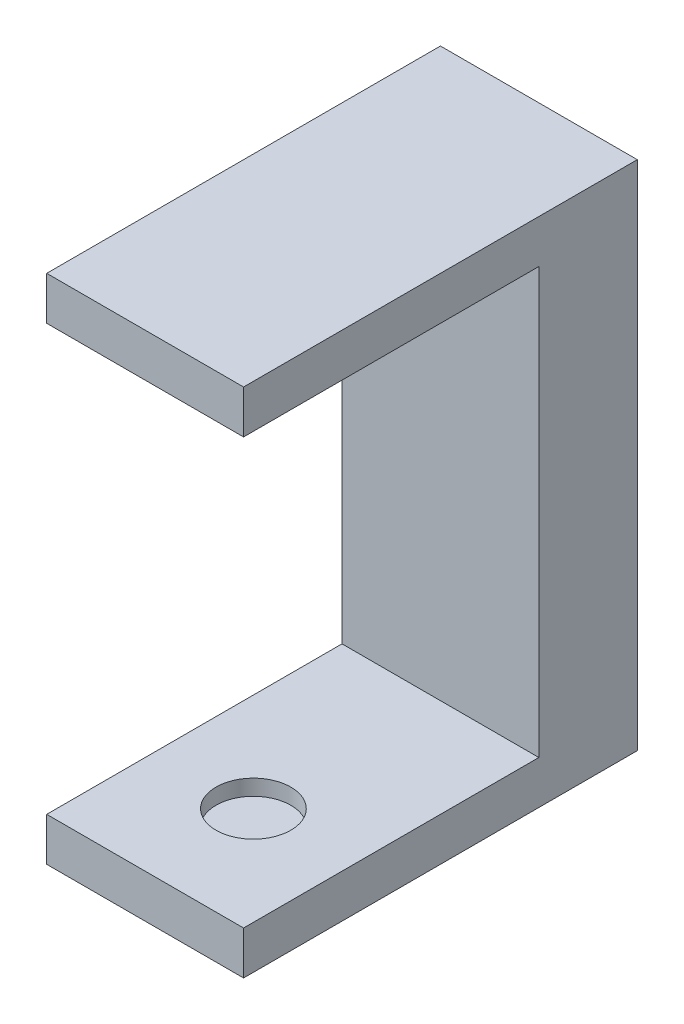
ISO-10303-21;
HEADER;
FILE_DESCRIPTION(('STEP AP214'),'2;1');
FILE_NAME('part.step','',(''),(''),'','','');
FILE_SCHEMA(('AUTOMOTIVE_DESIGN { 1 0 10303 214 1 1 1 1 }'));
ENDSEC;
DATA;
#1=APPLICATION_CONTEXT('core data for automotive mechanical design processes');
#2=APPLICATION_PROTOCOL_DEFINITION('international standard','automotive_design',2000,#1);
#3=PRODUCT_CONTEXT('',#1,'mechanical');
#4=PRODUCT('Part','Part','',(#3));
#5=PRODUCT_RELATED_PRODUCT_CATEGORY('part','',(#4));
#6=PRODUCT_DEFINITION_FORMATION('','',#4);
#7=PRODUCT_DEFINITION_CONTEXT('part definition',#1,'design');
#8=PRODUCT_DEFINITION('design','',#6,#7);
#9=PRODUCT_DEFINITION_SHAPE('','',#8);
#10=(LENGTH_UNIT() NAMED_UNIT(*) SI_UNIT(.MILLI.,.METRE.));
#11=(NAMED_UNIT(*) PLANE_ANGLE_UNIT() SI_UNIT($,.RADIAN.));
#12=(NAMED_UNIT(*) SI_UNIT($,.STERADIAN.) SOLID_ANGLE_UNIT());
#13=UNCERTAINTY_MEASURE_WITH_UNIT(LENGTH_MEASURE(1.E-05),#10,'distance_accuracy_value','');
#14=(GEOMETRIC_REPRESENTATION_CONTEXT(3) GLOBAL_UNCERTAINTY_ASSIGNED_CONTEXT((#13)) GLOBAL_UNIT_ASSIGNED_CONTEXT((#10,
#11,#12)) REPRESENTATION_CONTEXT('',''));
#15=CARTESIAN_POINT('',(0.,0.,0.));
#16=DIRECTION('',(0.,0.,1.));
#17=DIRECTION('',(1.,0.,0.));
#18=AXIS2_PLACEMENT_3D('',#15,#16,#17);
#19=CARTESIAN_POINT('',(0.,0.,20.));
#20=DIRECTION('',(0.,0.,-1.));
#21=DIRECTION('',(-1.,0.,0.));
#22=AXIS2_PLACEMENT_3D('',#19,#20,#21);
#23=PLANE('',#22);
#24=DIRECTION('',(0.,1.,0.));
#25=VECTOR('',#24,1.);
#26=CARTESIAN_POINT('',(5.,-13.,20.));
#27=LINE('',#26,#25);
#28=CARTESIAN_POINT('',(5.,-13.,20.));
#29=VERTEX_POINT('',#28);
#30=CARTESIAN_POINT('',(5.,-10.8,20.));
#31=VERTEX_POINT('',#30);
#32=EDGE_CURVE('E160',#29,#31,#27,.T.);
#33=ORIENTED_EDGE('',*,*,#32,.T.);
#34=DIRECTION('',(1.,0.,0.));
#35=VECTOR('',#34,1.);
#36=CARTESIAN_POINT('',(-5.,-10.8,20.));
#37=LINE('',#36,#35);
#38=CARTESIAN_POINT('',(-5.,-10.8,20.));
#39=VERTEX_POINT('',#38);
#40=EDGE_CURVE('E133',#39,#31,#37,.T.);
#41=ORIENTED_EDGE('',*,*,#40,.F.);
#42=DIRECTION('',(0.,1.,0.));
#43=VECTOR('',#42,1.);
#44=CARTESIAN_POINT('',(-5.,-13.,20.));
#45=LINE('',#44,#43);
#46=CARTESIAN_POINT('',(-5.,-13.,20.));
#47=VERTEX_POINT('',#46);
#48=EDGE_CURVE('E153',#47,#39,#45,.T.);
#49=ORIENTED_EDGE('',*,*,#48,.F.);
#50=DIRECTION('',(-1.,0.,0.));
#51=VECTOR('',#50,1.);
#52=CARTESIAN_POINT('',(5.,-13.,20.));
#53=LINE('',#52,#51);
#54=EDGE_CURVE('E148',#29,#47,#53,.T.);
#55=ORIENTED_EDGE('',*,*,#54,.F.);
#56=EDGE_LOOP('',(#33,#41,#49,#55));
#57=FACE_BOUND('',#56,.T.);
#58=ADVANCED_FACE('F44',(#57),#23,.F.);
#59=CARTESIAN_POINT('',(5.,-13.,20.));
#60=DIRECTION('',(0.,-1.,0.));
#61=DIRECTION('',(0.,0.,-1.));
#62=AXIS2_PLACEMENT_3D('',#59,#60,#61);
#63=PLANE('',#62);
#64=DIRECTION('',(-1.,0.,0.));
#65=VECTOR('',#64,1.);
#66=CARTESIAN_POINT('',(5.,-13.,0.));
#67=LINE('',#66,#65);
#68=CARTESIAN_POINT('',(5.,-13.,0.));
#69=VERTEX_POINT('',#68);
#70=CARTESIAN_POINT('',(-5.,-13.,0.));
#71=VERTEX_POINT('',#70);
#72=EDGE_CURVE('E164',#69,#71,#67,.T.);
#73=ORIENTED_EDGE('',*,*,#72,.F.);
#74=DIRECTION('',(0.,0.,-1.));
#75=VECTOR('',#74,1.);
#76=CARTESIAN_POINT('',(5.,-13.,20.));
#77=LINE('',#76,#75);
#78=EDGE_CURVE('E11',#29,#69,#77,.T.);
#79=ORIENTED_EDGE('',*,*,#78,.F.);
#80=ORIENTED_EDGE('',*,*,#54,.T.);
#81=DIRECTION('',(0.,0.,-1.));
#82=VECTOR('',#81,1.);
#83=CARTESIAN_POINT('',(-5.,-13.,20.));
#84=LINE('',#83,#82);
#85=EDGE_CURVE('E48',#47,#71,#84,.T.);
#86=ORIENTED_EDGE('',*,*,#85,.T.);
#87=EDGE_LOOP('',(#73,#79,#80,#86));
#88=FACE_BOUND('',#87,.T.);
#89=ADVANCED_FACE('F46',(#88),#63,.T.);
#90=CARTESIAN_POINT('',(5.,-13.,20.));
#91=DIRECTION('',(-1.,0.,0.));
#92=DIRECTION('',(0.,0.,1.));
#93=AXIS2_PLACEMENT_3D('',#90,#91,#92);
#94=PLANE('',#93);
#95=DIRECTION('',(0.,1.,0.));
#96=VECTOR('',#95,1.);
#97=CARTESIAN_POINT('',(5.,10.8,5.));
#98=LINE('',#97,#96);
#99=CARTESIAN_POINT('',(5.,-10.8,5.));
#100=VERTEX_POINT('',#99);
#101=CARTESIAN_POINT('',(5.,10.8,5.));
#102=VERTEX_POINT('',#101);
#103=EDGE_CURVE('E124',#100,#102,#98,.T.);
#104=ORIENTED_EDGE('',*,*,#103,.F.);
#105=DIRECTION('',(0.,0.,1.));
#106=VECTOR('',#105,1.);
#107=CARTESIAN_POINT('',(5.,-10.8,5.));
#108=LINE('',#107,#106);
#109=EDGE_CURVE('E169',#100,#31,#108,.T.);
#110=ORIENTED_EDGE('',*,*,#109,.T.);
#111=ORIENTED_EDGE('',*,*,#32,.F.);
#112=ORIENTED_EDGE('',*,*,#78,.T.);
#113=DIRECTION('',(0.,1.,0.));
#114=VECTOR('',#113,1.);
#115=CARTESIAN_POINT('',(5.,-13.,0.));
#116=LINE('',#115,#114);
#117=CARTESIAN_POINT('',(5.,13.,0.));
#118=VERTEX_POINT('',#117);
#119=EDGE_CURVE('E152',#69,#118,#116,.T.);
#120=ORIENTED_EDGE('',*,*,#119,.T.);
#121=DIRECTION('',(0.,0.,-1.));
#122=VECTOR('',#121,1.);
#123=CARTESIAN_POINT('',(5.,13.,20.));
#124=LINE('',#123,#122);
#125=CARTESIAN_POINT('',(5.,13.,20.));
#126=VERTEX_POINT('',#125);
#127=EDGE_CURVE('E54',#126,#118,#124,.T.);
#128=ORIENTED_EDGE('',*,*,#127,.F.);
#129=CARTESIAN_POINT('',(5.,10.8,20.));
#130=VERTEX_POINT('',#129);
#131=EDGE_CURVE('E138',#130,#126,#27,.T.);
#132=ORIENTED_EDGE('',*,*,#131,.F.);
#133=DIRECTION('',(0.,0.,1.));
#134=VECTOR('',#133,1.);
#135=CARTESIAN_POINT('',(5.,10.8,5.));
#136=LINE('',#135,#134);
#137=EDGE_CURVE('E62',#102,#130,#136,.T.);
#138=ORIENTED_EDGE('',*,*,#137,.F.);
#139=EDGE_LOOP('',(#104,#110,#111,#112,#120,#128,#132,#138));
#140=FACE_BOUND('',#139,.T.);
#141=ADVANCED_FACE('F136',(#140),#94,.F.);
#142=CARTESIAN_POINT('',(5.,13.,20.));
#143=DIRECTION('',(0.,-1.,0.));
#144=DIRECTION('',(0.,0.,-1.));
#145=AXIS2_PLACEMENT_3D('',#142,#143,#144);
#146=PLANE('',#145);
#147=DIRECTION('',(-1.,0.,0.));
#148=VECTOR('',#147,1.);
#149=CARTESIAN_POINT('',(5.,13.,0.));
#150=LINE('',#149,#148);
#151=CARTESIAN_POINT('',(-5.,13.,0.));
#152=VERTEX_POINT('',#151);
#153=EDGE_CURVE('E173',#118,#152,#150,.T.);
#154=ORIENTED_EDGE('',*,*,#153,.T.);
#155=DIRECTION('',(0.,0.,-1.));
#156=VECTOR('',#155,1.);
#157=CARTESIAN_POINT('',(-5.,13.,20.));
#158=LINE('',#157,#156);
#159=CARTESIAN_POINT('',(-5.,13.,20.));
#160=VERTEX_POINT('',#159);
#161=EDGE_CURVE('E181',#160,#152,#158,.T.);
#162=ORIENTED_EDGE('',*,*,#161,.F.);
#163=DIRECTION('',(-1.,0.,0.));
#164=VECTOR('',#163,1.);
#165=CARTESIAN_POINT('',(5.,13.,20.));
#166=LINE('',#165,#164);
#167=EDGE_CURVE('E156',#126,#160,#166,.T.);
#168=ORIENTED_EDGE('',*,*,#167,.F.);
#169=ORIENTED_EDGE('',*,*,#127,.T.);
#170=EDGE_LOOP('',(#154,#162,#168,#169));
#171=FACE_BOUND('',#170,.T.);
#172=ADVANCED_FACE('F193',(#171),#146,.F.);
#173=CARTESIAN_POINT('',(-5.,-13.,20.));
#174=DIRECTION('',(-1.,0.,0.));
#175=DIRECTION('',(0.,0.,1.));
#176=AXIS2_PLACEMENT_3D('',#173,#174,#175);
#177=PLANE('',#176);
#178=DIRECTION('',(0.,0.,1.));
#179=VECTOR('',#178,1.);
#180=CARTESIAN_POINT('',(-5.,-10.8,5.));
#181=LINE('',#180,#179);
#182=CARTESIAN_POINT('',(-5.,-10.8,5.));
#183=VERTEX_POINT('',#182);
#184=EDGE_CURVE('E143',#183,#39,#181,.T.);
#185=ORIENTED_EDGE('',*,*,#184,.F.);
#186=DIRECTION('',(0.,-1.,0.));
#187=VECTOR('',#186,1.);
#188=CARTESIAN_POINT('',(-5.,10.8,5.));
#189=LINE('',#188,#187);
#190=CARTESIAN_POINT('',(-5.,10.8,5.));
#191=VERTEX_POINT('',#190);
#192=EDGE_CURVE('E123',#191,#183,#189,.T.);
#193=ORIENTED_EDGE('',*,*,#192,.F.);
#194=DIRECTION('',(0.,0.,1.));
#195=VECTOR('',#194,1.);
#196=CARTESIAN_POINT('',(-5.,10.8,5.));
#197=LINE('',#196,#195);
#198=CARTESIAN_POINT('',(-5.,10.8,20.));
#199=VERTEX_POINT('',#198);
#200=EDGE_CURVE('E119',#191,#199,#197,.T.);
#201=ORIENTED_EDGE('',*,*,#200,.T.);
#202=EDGE_CURVE('E151',#199,#160,#45,.T.);
#203=ORIENTED_EDGE('',*,*,#202,.T.);
#204=ORIENTED_EDGE('',*,*,#161,.T.);
#205=DIRECTION('',(0.,1.,0.));
#206=VECTOR('',#205,1.);
#207=CARTESIAN_POINT('',(-5.,-13.,0.));
#208=LINE('',#207,#206);
#209=EDGE_CURVE('E168',#71,#152,#208,.T.);
#210=ORIENTED_EDGE('',*,*,#209,.F.);
#211=ORIENTED_EDGE('',*,*,#85,.F.);
#212=ORIENTED_EDGE('',*,*,#48,.T.);
#213=EDGE_LOOP('',(#185,#193,#201,#203,#204,#210,#211,#212));
#214=FACE_BOUND('',#213,.T.);
#215=ADVANCED_FACE('F187',(#214),#177,.T.);
#216=ORIENTED_EDGE('',*,*,#202,.F.);
#217=DIRECTION('',(-1.,0.,0.));
#218=VECTOR('',#217,1.);
#219=CARTESIAN_POINT('',(-5.,10.8,20.));
#220=LINE('',#219,#218);
#221=EDGE_CURVE('E197',#130,#199,#220,.T.);
#222=ORIENTED_EDGE('',*,*,#221,.F.);
#223=ORIENTED_EDGE('',*,*,#131,.T.);
#224=ORIENTED_EDGE('',*,*,#167,.T.);
#225=EDGE_LOOP('',(#216,#222,#223,#224));
#226=FACE_BOUND('',#225,.T.);
#227=ADVANCED_FACE('F196',(#226),#23,.F.);
#228=CARTESIAN_POINT('',(0.,0.,0.));
#229=DIRECTION('',(0.,0.,-1.));
#230=DIRECTION('',(-1.,0.,0.));
#231=AXIS2_PLACEMENT_3D('',#228,#229,#230);
#232=PLANE('',#231);
#233=ORIENTED_EDGE('',*,*,#72,.T.);
#234=ORIENTED_EDGE('',*,*,#209,.T.);
#235=ORIENTED_EDGE('',*,*,#153,.F.);
#236=ORIENTED_EDGE('',*,*,#119,.F.);
#237=EDGE_LOOP('',(#233,#234,#235,#236));
#238=FACE_BOUND('',#237,.T.);
#239=ADVANCED_FACE('F190',(#238),#232,.T.);
#240=CARTESIAN_POINT('',(-5.,-10.8,5.));
#241=DIRECTION('',(0.,-1.,0.));
#242=DIRECTION('',(0.,0.,-1.));
#243=AXIS2_PLACEMENT_3D('',#240,#241,#242);
#244=PLANE('',#243);
#245=CARTESIAN_POINT('',(0.,-10.8,14.5));
#246=DIRECTION('',(0.,1.,0.));
#247=DIRECTION('',(0.,0.,1.));
#248=AXIS2_PLACEMENT_3D('',#245,#246,#247);
#249=CIRCLE('',#248,1.9);
#250=CARTESIAN_POINT('',(0.,-10.8,16.4));
#251=VERTEX_POINT('',#250);
#252=EDGE_CURVE('E213',#251,#251,#249,.T.);
#253=ORIENTED_EDGE('',*,*,#252,.F.);
#254=EDGE_LOOP('',(#253));
#255=FACE_BOUND('',#254,.T.);
#256=ORIENTED_EDGE('',*,*,#40,.T.);
#257=ORIENTED_EDGE('',*,*,#109,.F.);
#258=DIRECTION('',(1.,0.,0.));
#259=VECTOR('',#258,1.);
#260=CARTESIAN_POINT('',(-5.,-10.8,5.));
#261=LINE('',#260,#259);
#262=EDGE_CURVE('E130',#183,#100,#261,.T.);
#263=ORIENTED_EDGE('',*,*,#262,.F.);
#264=ORIENTED_EDGE('',*,*,#184,.T.);
#265=EDGE_LOOP('',(#256,#257,#263,#264));
#266=FACE_BOUND('',#265,.T.);
#267=ADVANCED_FACE('F255',(#255,#266),#244,.F.);
#268=CARTESIAN_POINT('',(-5.,10.8,5.));
#269=DIRECTION('',(0.,1.,0.));
#270=DIRECTION('',(0.,0.,1.));
#271=AXIS2_PLACEMENT_3D('',#268,#269,#270);
#272=PLANE('',#271);
#273=CARTESIAN_POINT('',(0.,10.8,14.5));
#274=DIRECTION('',(0.,1.,0.));
#275=DIRECTION('',(0.,0.,1.));
#276=AXIS2_PLACEMENT_3D('',#273,#274,#275);
#277=CIRCLE('',#276,1.9);
#278=CARTESIAN_POINT('',(0.,10.8,16.4));
#279=VERTEX_POINT('',#278);
#280=EDGE_CURVE('E221',#279,#279,#277,.T.);
#281=ORIENTED_EDGE('',*,*,#280,.T.);
#282=EDGE_LOOP('',(#281));
#283=FACE_BOUND('',#282,.T.);
#284=ORIENTED_EDGE('',*,*,#221,.T.);
#285=ORIENTED_EDGE('',*,*,#200,.F.);
#286=DIRECTION('',(-1.,0.,0.));
#287=VECTOR('',#286,1.);
#288=CARTESIAN_POINT('',(-5.,10.8,5.));
#289=LINE('',#288,#287);
#290=EDGE_CURVE('E115',#102,#191,#289,.T.);
#291=ORIENTED_EDGE('',*,*,#290,.F.);
#292=ORIENTED_EDGE('',*,*,#137,.T.);
#293=EDGE_LOOP('',(#284,#285,#291,#292));
#294=FACE_BOUND('',#293,.T.);
#295=ADVANCED_FACE('F117',(#283,#294),#272,.F.);
#296=CARTESIAN_POINT('',(0.,0.,5.));
#297=DIRECTION('',(0.,0.,1.));
#298=DIRECTION('',(1.,0.,0.));
#299=AXIS2_PLACEMENT_3D('',#296,#297,#298);
#300=PLANE('',#299);
#301=ORIENTED_EDGE('',*,*,#103,.T.);
#302=ORIENTED_EDGE('',*,*,#290,.T.);
#303=ORIENTED_EDGE('',*,*,#192,.T.);
#304=ORIENTED_EDGE('',*,*,#262,.T.);
#305=EDGE_LOOP('',(#301,#302,#303,#304));
#306=FACE_BOUND('',#305,.T.);
#307=ADVANCED_FACE('F128',(#306),#300,.T.);
#308=CARTESIAN_POINT('',(0.,-11.6,14.5));
#309=DIRECTION('',(0.,1.,0.));
#310=DIRECTION('',(0.,0.,1.));
#311=AXIS2_PLACEMENT_3D('',#308,#309,#310);
#312=CYLINDRICAL_SURFACE('',#311,1.9);
#313=CARTESIAN_POINT('',(0.,-11.6,14.5));
#314=DIRECTION('',(0.,1.,0.));
#315=DIRECTION('',(0.,0.,1.));
#316=AXIS2_PLACEMENT_3D('',#313,#314,#315);
#317=CIRCLE('',#316,1.9);
#318=CARTESIAN_POINT('',(0.,-11.6,16.4));
#319=VERTEX_POINT('',#318);
#320=EDGE_CURVE('E209',#319,#319,#317,.T.);
#321=ORIENTED_EDGE('',*,*,#320,.F.);
#322=EDGE_LOOP('',(#321));
#323=FACE_BOUND('',#322,.T.);
#324=ORIENTED_EDGE('',*,*,#252,.T.);
#325=EDGE_LOOP('',(#324));
#326=FACE_BOUND('',#325,.T.);
#327=ADVANCED_FACE('F319',(#323,#326),#312,.F.);
#328=CARTESIAN_POINT('',(0.,-11.6,14.5));
#329=DIRECTION('',(0.,1.,0.));
#330=DIRECTION('',(0.,0.,1.));
#331=AXIS2_PLACEMENT_3D('',#328,#329,#330);
#332=PLANE('',#331);
#333=ORIENTED_EDGE('',*,*,#320,.T.);
#334=EDGE_LOOP('',(#333));
#335=FACE_BOUND('',#334,.T.);
#336=ADVANCED_FACE('F238',(#335),#332,.T.);
#337=CARTESIAN_POINT('',(0.,11.6,14.5));
#338=DIRECTION('',(0.,-1.,0.));
#339=DIRECTION('',(0.,0.,-1.));
#340=AXIS2_PLACEMENT_3D('',#337,#338,#339);
#341=CYLINDRICAL_SURFACE('',#340,1.9);
#342=CARTESIAN_POINT('',(0.,11.6,14.5));
#343=DIRECTION('',(0.,1.,0.));
#344=DIRECTION('',(0.,0.,1.));
#345=AXIS2_PLACEMENT_3D('',#342,#343,#344);
#346=CIRCLE('',#345,1.9);
#347=CARTESIAN_POINT('',(0.,11.6,16.4));
#348=VERTEX_POINT('',#347);
#349=EDGE_CURVE('E217',#348,#348,#346,.T.);
#350=ORIENTED_EDGE('',*,*,#349,.T.);
#351=EDGE_LOOP('',(#350));
#352=FACE_BOUND('',#351,.T.);
#353=ORIENTED_EDGE('',*,*,#280,.F.);
#354=EDGE_LOOP('',(#353));
#355=FACE_BOUND('',#354,.T.);
#356=ADVANCED_FACE('F229',(#352,#355),#341,.F.);
#357=CARTESIAN_POINT('',(0.,11.6,14.5));
#358=DIRECTION('',(0.,-1.,0.));
#359=DIRECTION('',(0.,0.,1.));
#360=AXIS2_PLACEMENT_3D('',#357,#358,#359);
#361=PLANE('',#360);
#362=ORIENTED_EDGE('',*,*,#349,.F.);
#363=EDGE_LOOP('',(#362));
#364=FACE_BOUND('',#363,.T.);
#365=ADVANCED_FACE('F232',(#364),#361,.T.);
#366=CLOSED_SHELL('',(#58,#89,#141,#172,#215,#227,#239,#267,#295,#307,#327,#336,#356,#365));
#367=MANIFOLD_SOLID_BREP('B2',#366);
#368=ADVANCED_BREP_SHAPE_REPRESENTATION('',(#18,#367),#14);
#369=SHAPE_DEFINITION_REPRESENTATION(#9,#368);
ENDSEC;
END-ISO-10303-21;
